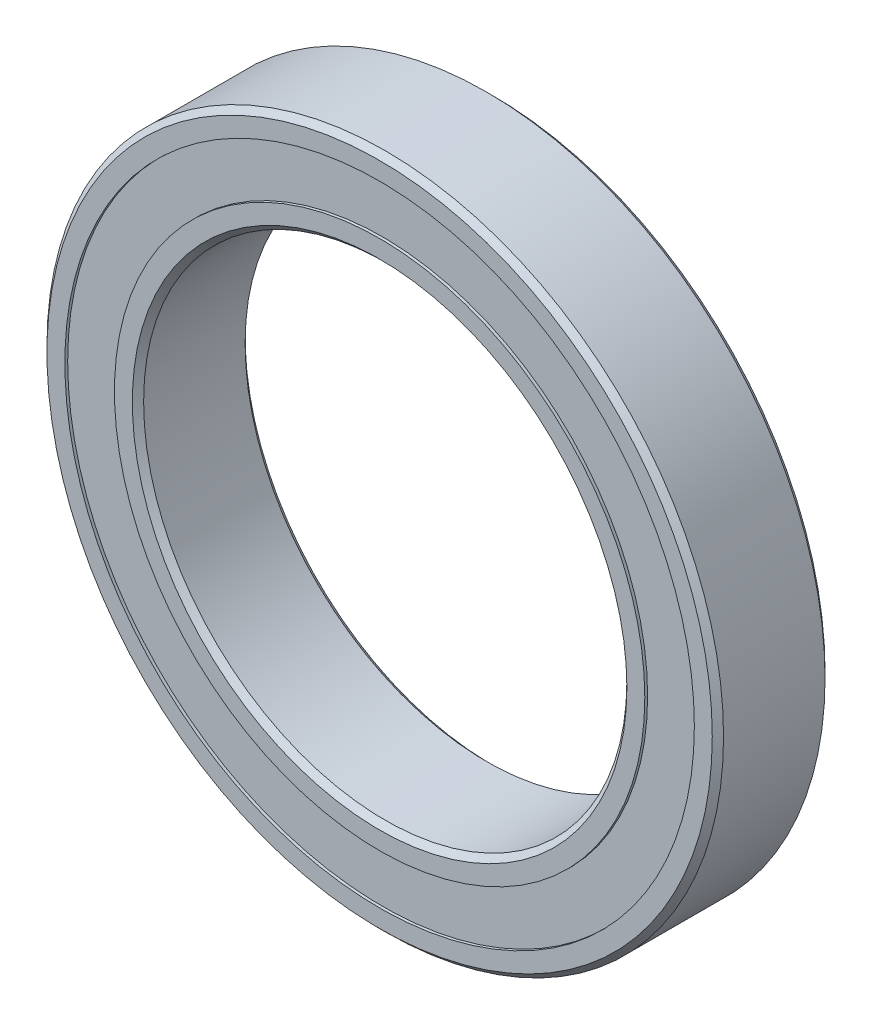
ISO-10303-21;
HEADER;
FILE_DESCRIPTION(('STEP AP214'),'2;1');
FILE_NAME('part.step','',(''),(''),'','','');
FILE_SCHEMA(('AUTOMOTIVE_DESIGN { 1 0 10303 214 1 1 1 1 }'));
ENDSEC;
DATA;
#1=APPLICATION_CONTEXT('core data for automotive mechanical design processes');
#2=APPLICATION_PROTOCOL_DEFINITION('international standard','automotive_design',2000,#1);
#3=PRODUCT_CONTEXT('',#1,'mechanical');
#4=PRODUCT('Part','Part','',(#3));
#5=PRODUCT_RELATED_PRODUCT_CATEGORY('part','',(#4));
#6=PRODUCT_DEFINITION_FORMATION('','',#4);
#7=PRODUCT_DEFINITION_CONTEXT('part definition',#1,'design');
#8=PRODUCT_DEFINITION('design','',#6,#7);
#9=PRODUCT_DEFINITION_SHAPE('','',#8);
#10=(LENGTH_UNIT() NAMED_UNIT(*) SI_UNIT(.MILLI.,.METRE.));
#11=(NAMED_UNIT(*) PLANE_ANGLE_UNIT() SI_UNIT($,.RADIAN.));
#12=(NAMED_UNIT(*) SI_UNIT($,.STERADIAN.) SOLID_ANGLE_UNIT());
#13=UNCERTAINTY_MEASURE_WITH_UNIT(LENGTH_MEASURE(1.E-05),#10,'distance_accuracy_value','');
#14=(GEOMETRIC_REPRESENTATION_CONTEXT(3) GLOBAL_UNCERTAINTY_ASSIGNED_CONTEXT((#13)) GLOBAL_UNIT_ASSIGNED_CONTEXT((#10,
#11,#12)) REPRESENTATION_CONTEXT('',''));
#15=CARTESIAN_POINT('',(0.,0.,0.));
#16=DIRECTION('',(0.,0.,1.));
#17=DIRECTION('',(1.,0.,0.));
#18=AXIS2_PLACEMENT_3D('',#15,#16,#17);
#19=CARTESIAN_POINT('',(-8.99987499999981,15.5882407617691,0.));
#20=DIRECTION('',(0.,0.,1.));
#21=DIRECTION('',(-0.499999999999989,0.866025403784445,0.));
#22=AXIS2_PLACEMENT_3D('',#19,#20,#21);
#23=SPHERICAL_SURFACE('',#22,2.18783385835058);
#24=CARTESIAN_POINT('',(-8.99987499999981,15.5882407617691,2.18783385835058));
#25=VERTEX_POINT('',#24);
#26=VERTEX_LOOP('',#25);
#27=FACE_BOUND('',#26,.T.);
#28=ADVANCED_FACE('F37',(#27),#23,.T.);
#29=CLOSED_SHELL('',(#28));
#30=MANIFOLD_SOLID_BREP('B2',#29);
#31=CARTESIAN_POINT('',(-15.5882407617689,8.99987500000019,0.));
#32=DIRECTION('',(0.,0.,1.));
#33=DIRECTION('',(-0.866025403784433,0.50000000000001,0.));
#34=AXIS2_PLACEMENT_3D('',#31,#32,#33);
#35=SPHERICAL_SURFACE('',#34,2.18783385835058);
#36=CARTESIAN_POINT('',(-15.5882407617689,8.99987500000019,2.18783385835058));
#37=VERTEX_POINT('',#36);
#38=VERTEX_LOOP('',#37);
#39=FACE_BOUND('',#38,.T.);
#40=ADVANCED_FACE('F57',(#39),#35,.T.);
#41=CLOSED_SHELL('',(#40));
#42=MANIFOLD_SOLID_BREP('B6',#41);
#43=CARTESIAN_POINT('',(-17.99975,1.88537373686525E-13,0.));
#44=DIRECTION('',(0.,0.,1.));
#45=DIRECTION('',(-1.,0.,0.));
#46=AXIS2_PLACEMENT_3D('',#43,#44,#45);
#47=SPHERICAL_SURFACE('',#46,2.18783385835058);
#48=CARTESIAN_POINT('',(-17.99975,1.88537373686525E-13,2.18783385835058));
#49=VERTEX_POINT('',#48);
#50=VERTEX_LOOP('',#49);
#51=FACE_BOUND('',#50,.T.);
#52=ADVANCED_FACE('F77',(#51),#47,.T.);
#53=CLOSED_SHELL('',(#52));
#54=MANIFOLD_SOLID_BREP('B33',#53);
#55=CARTESIAN_POINT('',(-15.588240761769,-8.99987499999986,0.));
#56=DIRECTION('',(0.,0.,1.));
#57=DIRECTION('',(-0.866025403784443,-0.499999999999992,0.));
#58=AXIS2_PLACEMENT_3D('',#55,#56,#57);
#59=SPHERICAL_SURFACE('',#58,2.18783385835058);
#60=CARTESIAN_POINT('',(-15.588240761769,-8.99987499999986,2.18783385835058));
#61=VERTEX_POINT('',#60);
#62=VERTEX_LOOP('',#61);
#63=FACE_BOUND('',#62,.T.);
#64=ADVANCED_FACE('F97',(#63),#59,.T.);
#65=CLOSED_SHELL('',(#64));
#66=MANIFOLD_SOLID_BREP('B53',#65);
#67=CARTESIAN_POINT('',(-8.99987500000013,-15.5882407617689,0.));
#68=DIRECTION('',(0.,0.,1.));
#69=DIRECTION('',(-0.500000000000007,-0.866025403784435,0.));
#70=AXIS2_PLACEMENT_3D('',#67,#68,#69);
#71=SPHERICAL_SURFACE('',#70,2.18783385835058);
#72=CARTESIAN_POINT('',(-8.99987500000013,-15.5882407617689,2.18783385835058));
#73=VERTEX_POINT('',#72);
#74=VERTEX_LOOP('',#73);
#75=FACE_BOUND('',#74,.T.);
#76=ADVANCED_FACE('F117',(#75),#71,.T.);
#77=CLOSED_SHELL('',(#76));
#78=MANIFOLD_SOLID_BREP('B73',#77);
#79=CARTESIAN_POINT('',(-1.25691582457683E-13,-17.99975,0.));
#80=DIRECTION('',(0.,0.,1.));
#81=DIRECTION('',(0.,-1.,0.));
#82=AXIS2_PLACEMENT_3D('',#79,#80,#81);
#83=SPHERICAL_SURFACE('',#82,2.18783385835058);
#84=CARTESIAN_POINT('',(-1.25691582457683E-13,-17.99975,2.18783385835058));
#85=VERTEX_POINT('',#84);
#86=VERTEX_LOOP('',#85);
#87=FACE_BOUND('',#86,.T.);
#88=ADVANCED_FACE('F137',(#87),#83,.T.);
#89=CLOSED_SHELL('',(#88));
#90=MANIFOLD_SOLID_BREP('B93',#89);
#91=CARTESIAN_POINT('',(8.99987499999991,-15.588240761769,0.));
#92=DIRECTION('',(0.,0.,1.));
#93=DIRECTION('',(0.499999999999995,-0.866025403784442,0.));
#94=AXIS2_PLACEMENT_3D('',#91,#92,#93);
#95=SPHERICAL_SURFACE('',#94,2.18783385835058);
#96=CARTESIAN_POINT('',(8.99987499999991,-15.588240761769,2.18783385835058));
#97=VERTEX_POINT('',#96);
#98=VERTEX_LOOP('',#97);
#99=FACE_BOUND('',#98,.T.);
#100=ADVANCED_FACE('F157',(#99),#95,.T.);
#101=CLOSED_SHELL('',(#100));
#102=MANIFOLD_SOLID_BREP('B113',#101);
#103=CARTESIAN_POINT('',(15.5882407617689,-8.99987500000008,0.));
#104=DIRECTION('',(0.,0.,1.));
#105=DIRECTION('',(0.866025403784436,-0.500000000000004,0.));
#106=AXIS2_PLACEMENT_3D('',#103,#104,#105);
#107=SPHERICAL_SURFACE('',#106,2.18783385835058);
#108=CARTESIAN_POINT('',(15.5882407617689,-8.99987500000008,2.18783385835058));
#109=VERTEX_POINT('',#108);
#110=VERTEX_LOOP('',#109);
#111=FACE_BOUND('',#110,.T.);
#112=ADVANCED_FACE('F177',(#111),#107,.T.);
#113=CLOSED_SHELL('',(#112));
#114=MANIFOLD_SOLID_BREP('B133',#113);
#115=CARTESIAN_POINT('',(17.99975,0.,0.));
#116=DIRECTION('',(0.,0.,1.));
#117=DIRECTION('',(1.,0.,0.));
#118=AXIS2_PLACEMENT_3D('',#115,#116,#117);
#119=SPHERICAL_SURFACE('',#118,2.18783385835058);
#120=CARTESIAN_POINT('',(17.99975,0.,2.18783385835058));
#121=VERTEX_POINT('',#120);
#122=VERTEX_LOOP('',#121);
#123=FACE_BOUND('',#122,.T.);
#124=ADVANCED_FACE('F197',(#123),#119,.T.);
#125=CLOSED_SHELL('',(#124));
#126=MANIFOLD_SOLID_BREP('B153',#125);
#127=CARTESIAN_POINT('',(15.588240761769,8.99987499999997,0.));
#128=DIRECTION('',(0.,0.,1.));
#129=DIRECTION('',(0.86602540378444,0.499999999999998,0.));
#130=AXIS2_PLACEMENT_3D('',#127,#128,#129);
#131=SPHERICAL_SURFACE('',#130,2.18783385835058);
#132=CARTESIAN_POINT('',(15.588240761769,8.99987499999997,2.18783385835058));
#133=VERTEX_POINT('',#132);
#134=VERTEX_LOOP('',#133);
#135=FACE_BOUND('',#134,.T.);
#136=ADVANCED_FACE('F217',(#135),#131,.T.);
#137=CLOSED_SHELL('',(#136));
#138=MANIFOLD_SOLID_BREP('B173',#137);
#139=CARTESIAN_POINT('',(8.99987500000002,15.5882407617689,0.));
#140=DIRECTION('',(0.,0.,1.));
#141=DIRECTION('',(0.500000000000001,0.866025403784438,0.));
#142=AXIS2_PLACEMENT_3D('',#139,#140,#141);
#143=SPHERICAL_SURFACE('',#142,2.18783385835058);
#144=CARTESIAN_POINT('',(8.99987500000002,15.5882407617689,2.18783385835058));
#145=VERTEX_POINT('',#144);
#146=VERTEX_LOOP('',#145);
#147=FACE_BOUND('',#146,.T.);
#148=ADVANCED_FACE('F237',(#147),#143,.T.);
#149=CLOSED_SHELL('',(#148));
#150=MANIFOLD_SOLID_BREP('B193',#149);
#151=CARTESIAN_POINT('',(0.,17.99975,0.));
#152=DIRECTION('',(0.,0.,1.));
#153=DIRECTION('',(0.,1.,0.));
#154=AXIS2_PLACEMENT_3D('',#151,#152,#153);
#155=SPHERICAL_SURFACE('',#154,2.18783385835058);
#156=CARTESIAN_POINT('',(0.,17.99975,2.18783385835058));
#157=VERTEX_POINT('',#156);
#158=VERTEX_LOOP('',#157);
#159=FACE_BOUND('',#158,.T.);
#160=ADVANCED_FACE('F258',(#159),#155,.T.);
#161=CLOSED_SHELL('',(#160));
#162=MANIFOLD_SOLID_BREP('B213',#161);
#163=CARTESIAN_POINT('',(0.,0.,3.5));
#164=DIRECTION('',(0.,0.,1.));
#165=DIRECTION('',(1.,0.,0.));
#166=AXIS2_PLACEMENT_3D('',#163,#164,#165);
#167=CYLINDRICAL_SURFACE('',#166,19.5382115384615);
#168=CARTESIAN_POINT('',(0.,0.,-3.5));
#169=DIRECTION('',(0.,0.,1.));
#170=DIRECTION('',(1.,0.,0.));
#171=AXIS2_PLACEMENT_3D('',#168,#169,#170);
#172=CIRCLE('',#171,19.5382115384616);
#173=CARTESIAN_POINT('',(19.5382115384616,0.,-3.5));
#174=VERTEX_POINT('',#173);
#175=EDGE_CURVE('E310',#174,#174,#172,.T.);
#176=ORIENTED_EDGE('',*,*,#175,.F.);
#177=EDGE_LOOP('',(#176));
#178=FACE_BOUND('',#177,.T.);
#179=CARTESIAN_POINT('',(0.,0.,-3.32499999999999));
#180=DIRECTION('',(0.,0.,1.));
#181=DIRECTION('',(1.,0.,0.));
#182=AXIS2_PLACEMENT_3D('',#179,#180,#181);
#183=CIRCLE('',#182,19.5382115384615);
#184=CARTESIAN_POINT('',(19.5382115384615,0.,-3.32499999999999));
#185=VERTEX_POINT('',#184);
#186=EDGE_CURVE('E257',#185,#185,#183,.F.);
#187=ORIENTED_EDGE('',*,*,#186,.F.);
#188=EDGE_LOOP('',(#187));
#189=FACE_BOUND('',#188,.T.);
#190=ADVANCED_FACE('F271',(#178,#189),#167,.F.);
#191=CARTESIAN_POINT('',(0.,0.,3.5));
#192=DIRECTION('',(0.,0.,1.));
#193=DIRECTION('',(1.,0.,0.));
#194=AXIS2_PLACEMENT_3D('',#191,#192,#193);
#195=CYLINDRICAL_SURFACE('',#194,16.4612884615385);
#196=CARTESIAN_POINT('',(0.,0.,-3.5));
#197=DIRECTION('',(0.,0.,1.));
#198=DIRECTION('',(1.,0.,0.));
#199=AXIS2_PLACEMENT_3D('',#196,#197,#198);
#200=CIRCLE('',#199,16.4612884615385);
#201=CARTESIAN_POINT('',(16.4612884615385,0.,-3.5));
#202=VERTEX_POINT('',#201);
#203=EDGE_CURVE('E337',#202,#202,#200,.T.);
#204=ORIENTED_EDGE('',*,*,#203,.T.);
#205=EDGE_LOOP('',(#204));
#206=FACE_BOUND('',#205,.T.);
#207=CARTESIAN_POINT('',(0.,0.,-3.32499999999999));
#208=DIRECTION('',(0.,0.,1.));
#209=DIRECTION('',(1.,0.,0.));
#210=AXIS2_PLACEMENT_3D('',#207,#208,#209);
#211=CIRCLE('',#210,16.4612884615385);
#212=CARTESIAN_POINT('',(16.4612884615385,0.,-3.32499999999999));
#213=VERTEX_POINT('',#212);
#214=EDGE_CURVE('E283',#213,#213,#211,.T.);
#215=ORIENTED_EDGE('',*,*,#214,.F.);
#216=EDGE_LOOP('',(#215));
#217=FACE_BOUND('',#216,.T.);
#218=ADVANCED_FACE('F379',(#206,#217),#195,.T.);
#219=CARTESIAN_POINT('',(0.,0.,3.5));
#220=DIRECTION('',(0.,0.,1.));
#221=DIRECTION('',(1.,0.,0.));
#222=AXIS2_PLACEMENT_3D('',#219,#220,#221);
#223=CYLINDRICAL_SURFACE('',#222,19.5382115384615);
#224=CARTESIAN_POINT('',(0.,0.,3.5));
#225=DIRECTION('',(0.,0.,1.));
#226=DIRECTION('',(1.,0.,0.));
#227=AXIS2_PLACEMENT_3D('',#224,#225,#226);
#228=CIRCLE('',#227,19.5382115384616);
#229=CARTESIAN_POINT('',(19.5382115384616,0.,3.5));
#230=VERTEX_POINT('',#229);
#231=EDGE_CURVE('E301',#230,#230,#228,.T.);
#232=ORIENTED_EDGE('',*,*,#231,.T.);
#233=EDGE_LOOP('',(#232));
#234=FACE_BOUND('',#233,.T.);
#235=CARTESIAN_POINT('',(0.,0.,3.32499999999999));
#236=DIRECTION('',(0.,0.,-1.));
#237=DIRECTION('',(-1.,0.,0.));
#238=AXIS2_PLACEMENT_3D('',#235,#236,#237);
#239=CIRCLE('',#238,19.5382115384615);
#240=CARTESIAN_POINT('',(-19.5382115384615,0.,3.32499999999999));
#241=VERTEX_POINT('',#240);
#242=EDGE_CURVE('E292',#241,#241,#239,.F.);
#243=ORIENTED_EDGE('',*,*,#242,.F.);
#244=EDGE_LOOP('',(#243));
#245=FACE_BOUND('',#244,.T.);
#246=ADVANCED_FACE('F377',(#234,#245),#223,.F.);
#247=CARTESIAN_POINT('',(0.,0.,3.15));
#248=DIRECTION('',(0.,0.,-1.));
#249=DIRECTION('',(-1.,0.,0.));
#250=AXIS2_PLACEMENT_3D('',#247,#248,#249);
#251=CONICAL_SURFACE('',#250,21.,0.78539816339744);
#252=CARTESIAN_POINT('',(0.,0.,3.5));
#253=DIRECTION('',(0.,0.,1.));
#254=DIRECTION('',(1.,0.,0.));
#255=AXIS2_PLACEMENT_3D('',#252,#253,#254);
#256=CIRCLE('',#255,20.65);
#257=CARTESIAN_POINT('',(20.65,0.,3.5));
#258=VERTEX_POINT('',#257);
#259=EDGE_CURVE('E298',#258,#258,#256,.T.);
#260=ORIENTED_EDGE('',*,*,#259,.F.);
#261=EDGE_LOOP('',(#260));
#262=FACE_BOUND('',#261,.T.);
#263=CARTESIAN_POINT('',(0.,0.,3.15));
#264=DIRECTION('',(0.,0.,1.));
#265=DIRECTION('',(1.,0.,0.));
#266=AXIS2_PLACEMENT_3D('',#263,#264,#265);
#267=CIRCLE('',#266,21.);
#268=CARTESIAN_POINT('',(21.,0.,3.15));
#269=VERTEX_POINT('',#268);
#270=EDGE_CURVE('E319',#269,#269,#267,.T.);
#271=ORIENTED_EDGE('',*,*,#270,.T.);
#272=EDGE_LOOP('',(#271));
#273=FACE_BOUND('',#272,.T.);
#274=ADVANCED_FACE('F273',(#262,#273),#251,.T.);
#275=CARTESIAN_POINT('',(0.,20.65,3.5));
#276=DIRECTION('',(0.,0.,-1.));
#277=DIRECTION('',(-1.,0.,0.));
#278=AXIS2_PLACEMENT_3D('',#275,#276,#277);
#279=PLANE('',#278);
#280=ORIENTED_EDGE('',*,*,#231,.F.);
#281=EDGE_LOOP('',(#280));
#282=FACE_BOUND('',#281,.T.);
#283=ORIENTED_EDGE('',*,*,#259,.T.);
#284=EDGE_LOOP('',(#283));
#285=FACE_BOUND('',#284,.T.);
#286=ADVANCED_FACE('F387',(#282,#285),#279,.F.);
#287=CARTESIAN_POINT('',(0.,20.65,-3.5));
#288=DIRECTION('',(0.,0.,1.));
#289=DIRECTION('',(1.,0.,0.));
#290=AXIS2_PLACEMENT_3D('',#287,#288,#289);
#291=PLANE('',#290);
#292=CARTESIAN_POINT('',(0.,0.,-3.5));
#293=DIRECTION('',(0.,0.,1.));
#294=DIRECTION('',(1.,0.,0.));
#295=AXIS2_PLACEMENT_3D('',#292,#293,#294);
#296=CIRCLE('',#295,20.65);
#297=CARTESIAN_POINT('',(20.65,0.,-3.5));
#298=VERTEX_POINT('',#297);
#299=EDGE_CURVE('E313',#298,#298,#296,.T.);
#300=ORIENTED_EDGE('',*,*,#299,.F.);
#301=EDGE_LOOP('',(#300));
#302=FACE_BOUND('',#301,.T.);
#303=ORIENTED_EDGE('',*,*,#175,.T.);
#304=EDGE_LOOP('',(#303));
#305=FACE_BOUND('',#304,.T.);
#306=ADVANCED_FACE('F449',(#302,#305),#291,.F.);
#307=CARTESIAN_POINT('',(0.,0.,-3.5));
#308=DIRECTION('',(0.,0.,1.));
#309=DIRECTION('',(1.,0.,0.));
#310=AXIS2_PLACEMENT_3D('',#307,#308,#309);
#311=CONICAL_SURFACE('',#310,20.65,0.78539816339745);
#312=CARTESIAN_POINT('',(0.,0.,-3.15));
#313=DIRECTION('',(0.,0.,1.));
#314=DIRECTION('',(1.,0.,0.));
#315=AXIS2_PLACEMENT_3D('',#312,#313,#314);
#316=CIRCLE('',#315,21.);
#317=CARTESIAN_POINT('',(21.,0.,-3.15));
#318=VERTEX_POINT('',#317);
#319=EDGE_CURVE('E316',#318,#318,#316,.T.);
#320=ORIENTED_EDGE('',*,*,#319,.F.);
#321=EDGE_LOOP('',(#320));
#322=FACE_BOUND('',#321,.T.);
#323=ORIENTED_EDGE('',*,*,#299,.T.);
#324=EDGE_LOOP('',(#323));
#325=FACE_BOUND('',#324,.T.);
#326=ADVANCED_FACE('F446',(#322,#325),#311,.T.);
#327=CARTESIAN_POINT('',(0.,0.,3.5));
#328=DIRECTION('',(0.,0.,1.));
#329=DIRECTION('',(1.,0.,0.));
#330=AXIS2_PLACEMENT_3D('',#327,#328,#329);
#331=CYLINDRICAL_SURFACE('',#330,21.);
#332=ORIENTED_EDGE('',*,*,#270,.F.);
#333=EDGE_LOOP('',(#332));
#334=FACE_BOUND('',#333,.T.);
#335=ORIENTED_EDGE('',*,*,#319,.T.);
#336=EDGE_LOOP('',(#335));
#337=FACE_BOUND('',#336,.T.);
#338=ADVANCED_FACE('F373',(#334,#337),#331,.T.);
#339=CARTESIAN_POINT('',(0.,19.5382115384616,3.32499999999999));
#340=DIRECTION('',(0.,0.,-1.));
#341=DIRECTION('',(-1.,0.,0.));
#342=AXIS2_PLACEMENT_3D('',#339,#340,#341);
#343=PLANE('',#342);
#344=CARTESIAN_POINT('',(0.,0.,3.32499999999999));
#345=DIRECTION('',(0.,0.,1.));
#346=DIRECTION('',(1.,0.,0.));
#347=AXIS2_PLACEMENT_3D('',#344,#345,#346);
#348=CIRCLE('',#347,16.4612884615385);
#349=CARTESIAN_POINT('',(16.4612884615385,0.,3.32499999999999));
#350=VERTEX_POINT('',#349);
#351=EDGE_CURVE('E322',#350,#350,#348,.T.);
#352=ORIENTED_EDGE('',*,*,#351,.F.);
#353=EDGE_LOOP('',(#352));
#354=FACE_BOUND('',#353,.T.);
#355=ORIENTED_EDGE('',*,*,#242,.T.);
#356=EDGE_LOOP('',(#355));
#357=FACE_BOUND('',#356,.T.);
#358=ADVANCED_FACE('F366',(#354,#357),#343,.F.);
#359=CARTESIAN_POINT('',(0.,0.,3.5));
#360=DIRECTION('',(0.,0.,1.));
#361=DIRECTION('',(1.,0.,0.));
#362=AXIS2_PLACEMENT_3D('',#359,#360,#361);
#363=CYLINDRICAL_SURFACE('',#362,16.4612884615385);
#364=CARTESIAN_POINT('',(0.,0.,3.5));
#365=DIRECTION('',(0.,0.,1.));
#366=DIRECTION('',(1.,0.,0.));
#367=AXIS2_PLACEMENT_3D('',#364,#365,#366);
#368=CIRCLE('',#367,16.4612884615385);
#369=CARTESIAN_POINT('',(16.4612884615385,0.,3.5));
#370=VERTEX_POINT('',#369);
#371=EDGE_CURVE('E346',#370,#370,#368,.T.);
#372=ORIENTED_EDGE('',*,*,#371,.F.);
#373=EDGE_LOOP('',(#372));
#374=FACE_BOUND('',#373,.T.);
#375=ORIENTED_EDGE('',*,*,#351,.T.);
#376=EDGE_LOOP('',(#375));
#377=FACE_BOUND('',#376,.T.);
#378=ADVANCED_FACE('F363',(#374,#377),#363,.T.);
#379=CARTESIAN_POINT('',(0.,0.,3.5));
#380=DIRECTION('',(0.,0.,1.));
#381=DIRECTION('',(1.,0.,0.));
#382=AXIS2_PLACEMENT_3D('',#379,#380,#381);
#383=CONICAL_SURFACE('',#382,15.3495,0.785398163397457);
#384=CARTESIAN_POINT('',(0.,0.,3.15));
#385=DIRECTION('',(0.,0.,1.));
#386=DIRECTION('',(1.,0.,0.));
#387=AXIS2_PLACEMENT_3D('',#384,#385,#386);
#388=CIRCLE('',#387,14.9995);
#389=CARTESIAN_POINT('',(14.9995,0.,3.15));
#390=VERTEX_POINT('',#389);
#391=EDGE_CURVE('E328',#390,#390,#388,.T.);
#392=ORIENTED_EDGE('',*,*,#391,.F.);
#393=EDGE_LOOP('',(#392));
#394=FACE_BOUND('',#393,.T.);
#395=CARTESIAN_POINT('',(0.,0.,3.5));
#396=DIRECTION('',(0.,0.,1.));
#397=DIRECTION('',(1.,0.,0.));
#398=AXIS2_PLACEMENT_3D('',#395,#396,#397);
#399=CIRCLE('',#398,15.3495);
#400=CARTESIAN_POINT('',(15.3495,0.,3.5));
#401=VERTEX_POINT('',#400);
#402=EDGE_CURVE('E349',#401,#401,#399,.T.);
#403=ORIENTED_EDGE('',*,*,#402,.T.);
#404=EDGE_LOOP('',(#403));
#405=FACE_BOUND('',#404,.T.);
#406=ADVANCED_FACE('F353',(#394,#405),#383,.F.);
#407=CARTESIAN_POINT('',(0.,0.,3.5));
#408=DIRECTION('',(0.,0.,1.));
#409=DIRECTION('',(1.,0.,0.));
#410=AXIS2_PLACEMENT_3D('',#407,#408,#409);
#411=CYLINDRICAL_SURFACE('',#410,14.9995);
#412=CARTESIAN_POINT('',(0.,0.,-3.15));
#413=DIRECTION('',(0.,0.,1.));
#414=DIRECTION('',(1.,0.,0.));
#415=AXIS2_PLACEMENT_3D('',#412,#413,#414);
#416=CIRCLE('',#415,14.9995);
#417=CARTESIAN_POINT('',(14.9995,0.,-3.15));
#418=VERTEX_POINT('',#417);
#419=EDGE_CURVE('E331',#418,#418,#416,.T.);
#420=ORIENTED_EDGE('',*,*,#419,.F.);
#421=EDGE_LOOP('',(#420));
#422=FACE_BOUND('',#421,.T.);
#423=ORIENTED_EDGE('',*,*,#391,.T.);
#424=EDGE_LOOP('',(#423));
#425=FACE_BOUND('',#424,.T.);
#426=ADVANCED_FACE('F436',(#422,#425),#411,.F.);
#427=CARTESIAN_POINT('',(0.,0.,-3.15));
#428=DIRECTION('',(0.,0.,-1.));
#429=DIRECTION('',(-1.,0.,0.));
#430=AXIS2_PLACEMENT_3D('',#427,#428,#429);
#431=CONICAL_SURFACE('',#430,14.9995,0.785398163397452);
#432=CARTESIAN_POINT('',(0.,0.,-3.5));
#433=DIRECTION('',(0.,0.,1.));
#434=DIRECTION('',(1.,0.,0.));
#435=AXIS2_PLACEMENT_3D('',#432,#433,#434);
#436=CIRCLE('',#435,15.3495);
#437=CARTESIAN_POINT('',(15.3495,0.,-3.5));
#438=VERTEX_POINT('',#437);
#439=EDGE_CURVE('E334',#438,#438,#436,.T.);
#440=ORIENTED_EDGE('',*,*,#439,.F.);
#441=EDGE_LOOP('',(#440));
#442=FACE_BOUND('',#441,.T.);
#443=ORIENTED_EDGE('',*,*,#419,.T.);
#444=EDGE_LOOP('',(#443));
#445=FACE_BOUND('',#444,.T.);
#446=ADVANCED_FACE('F432',(#442,#445),#431,.F.);
#447=CARTESIAN_POINT('',(0.,15.3495,-3.5));
#448=DIRECTION('',(0.,0.,1.));
#449=DIRECTION('',(1.,0.,0.));
#450=AXIS2_PLACEMENT_3D('',#447,#448,#449);
#451=PLANE('',#450);
#452=ORIENTED_EDGE('',*,*,#203,.F.);
#453=EDGE_LOOP('',(#452));
#454=FACE_BOUND('',#453,.T.);
#455=ORIENTED_EDGE('',*,*,#439,.T.);
#456=EDGE_LOOP('',(#455));
#457=FACE_BOUND('',#456,.T.);
#458=ADVANCED_FACE('F359',(#454,#457),#451,.F.);
#459=CARTESIAN_POINT('',(0.,15.3495,3.5));
#460=DIRECTION('',(0.,0.,-1.));
#461=DIRECTION('',(-1.,0.,0.));
#462=AXIS2_PLACEMENT_3D('',#459,#460,#461);
#463=PLANE('',#462);
#464=ORIENTED_EDGE('',*,*,#402,.F.);
#465=EDGE_LOOP('',(#464));
#466=FACE_BOUND('',#465,.T.);
#467=ORIENTED_EDGE('',*,*,#371,.T.);
#468=EDGE_LOOP('',(#467));
#469=FACE_BOUND('',#468,.T.);
#470=ADVANCED_FACE('F355',(#466,#469),#463,.F.);
#471=CARTESIAN_POINT('',(0.,19.5382115384616,-3.32499999999999));
#472=DIRECTION('',(0.,0.,1.));
#473=DIRECTION('',(1.,0.,0.));
#474=AXIS2_PLACEMENT_3D('',#471,#472,#473);
#475=PLANE('',#474);
#476=ORIENTED_EDGE('',*,*,#186,.T.);
#477=EDGE_LOOP('',(#476));
#478=FACE_BOUND('',#477,.T.);
#479=ORIENTED_EDGE('',*,*,#214,.T.);
#480=EDGE_LOOP('',(#479));
#481=FACE_BOUND('',#480,.T.);
#482=ADVANCED_FACE('F358',(#478,#481),#475,.F.);
#483=CLOSED_SHELL('',(#190,#218,#246,#274,#286,#306,#326,#338,#358,#378,#406,#426,#446,#458,
#470,#482));
#484=CARTESIAN_POINT('',(0.,19.5382115384616,-2.18783385835058));
#485=DIRECTION('',(0.,0.,-1.));
#486=DIRECTION('',(-1.,0.,0.));
#487=AXIS2_PLACEMENT_3D('',#484,#485,#486);
#488=PLANE('',#487);
#489=CARTESIAN_POINT('',(0.,0.,-2.18783385835058));
#490=DIRECTION('',(0.,0.,-1.));
#491=DIRECTION('',(-1.,0.,0.));
#492=AXIS2_PLACEMENT_3D('',#489,#490,#491);
#493=CIRCLE('',#492,16.4612884615385);
#494=CARTESIAN_POINT('',(-16.4612884615385,0.,-2.18783385835058));
#495=VERTEX_POINT('',#494);
#496=EDGE_CURVE('E287',#495,#495,#493,.T.);
#497=ORIENTED_EDGE('',*,*,#496,.T.);
#498=EDGE_LOOP('',(#497));
#499=FACE_BOUND('',#498,.T.);
#500=CARTESIAN_POINT('',(0.,0.,-2.18783385835058));
#501=DIRECTION('',(0.,0.,-1.));
#502=DIRECTION('',(-1.,0.,0.));
#503=AXIS2_PLACEMENT_3D('',#500,#501,#502);
#504=CIRCLE('',#503,19.5382115384615);
#505=CARTESIAN_POINT('',(-19.5382115384615,0.,-2.18783385835058));
#506=VERTEX_POINT('',#505);
#507=EDGE_CURVE('E279',#506,#506,#504,.F.);
#508=ORIENTED_EDGE('',*,*,#507,.T.);
#509=EDGE_LOOP('',(#508));
#510=FACE_BOUND('',#509,.T.);
#511=ADVANCED_FACE('F395',(#499,#510),#488,.F.);
#512=CARTESIAN_POINT('',(0.,0.,1.55555555555556));
#513=DIRECTION('',(0.,0.,1.));
#514=DIRECTION('',(1.,0.,0.));
#515=AXIS2_PLACEMENT_3D('',#512,#513,#514);
#516=CIRCLE('',#515,19.5382115384615);
#517=CARTESIAN_POINT('',(19.5382115384615,0.,1.55555555555556));
#518=VERTEX_POINT('',#517);
#519=EDGE_CURVE('E304',#518,#518,#516,.T.);
#520=ORIENTED_EDGE('',*,*,#519,.F.);
#521=EDGE_LOOP('',(#520));
#522=FACE_BOUND('',#521,.T.);
#523=CARTESIAN_POINT('',(0.,0.,2.18783385835058));
#524=DIRECTION('',(0.,0.,1.));
#525=DIRECTION('',(1.,0.,0.));
#526=AXIS2_PLACEMENT_3D('',#523,#524,#525);
#527=CIRCLE('',#526,19.5382115384615);
#528=CARTESIAN_POINT('',(19.5382115384615,0.,2.18783385835058));
#529=VERTEX_POINT('',#528);
#530=EDGE_CURVE('E295',#529,#529,#527,.F.);
#531=ORIENTED_EDGE('',*,*,#530,.F.);
#532=EDGE_LOOP('',(#531));
#533=FACE_BOUND('',#532,.T.);
#534=ADVANCED_FACE('F382',(#522,#533),#223,.F.);
#535=CARTESIAN_POINT('',(0.,0.,0.));
#536=DIRECTION('',(0.,0.,1.));
#537=DIRECTION('',(1.,0.,0.));
#538=AXIS2_PLACEMENT_3D('',#535,#536,#537);
#539=TOROIDAL_SURFACE('',#538,17.99975,2.18783385835058);
#540=CARTESIAN_POINT('',(0.,0.,-1.55555555555556));
#541=DIRECTION('',(0.,0.,1.));
#542=DIRECTION('',(1.,0.,0.));
#543=AXIS2_PLACEMENT_3D('',#540,#541,#542);
#544=CIRCLE('',#543,19.5382115384615);
#545=CARTESIAN_POINT('',(19.5382115384615,0.,-1.55555555555556));
#546=VERTEX_POINT('',#545);
#547=EDGE_CURVE('E307',#546,#546,#544,.T.);
#548=ORIENTED_EDGE('',*,*,#547,.F.);
#549=EDGE_LOOP('',(#548));
#550=FACE_BOUND('',#549,.T.);
#551=ORIENTED_EDGE('',*,*,#519,.T.);
#552=EDGE_LOOP('',(#551));
#553=FACE_BOUND('',#552,.T.);
#554=ADVANCED_FACE('F394',(#550,#553),#539,.F.);
#555=ORIENTED_EDGE('',*,*,#547,.T.);
#556=EDGE_LOOP('',(#555));
#557=FACE_BOUND('',#556,.T.);
#558=ORIENTED_EDGE('',*,*,#507,.F.);
#559=EDGE_LOOP('',(#558));
#560=FACE_BOUND('',#559,.T.);
#561=ADVANCED_FACE('F401',(#557,#560),#167,.F.);
#562=CARTESIAN_POINT('',(0.,19.5382115384616,2.18783385835058));
#563=DIRECTION('',(0.,0.,1.));
#564=DIRECTION('',(1.,0.,0.));
#565=AXIS2_PLACEMENT_3D('',#562,#563,#564);
#566=PLANE('',#565);
#567=ORIENTED_EDGE('',*,*,#530,.T.);
#568=EDGE_LOOP('',(#567));
#569=FACE_BOUND('',#568,.T.);
#570=CARTESIAN_POINT('',(0.,0.,2.18783385835058));
#571=DIRECTION('',(0.,0.,1.));
#572=DIRECTION('',(1.,0.,0.));
#573=AXIS2_PLACEMENT_3D('',#570,#571,#572);
#574=CIRCLE('',#573,16.4612884615385);
#575=CARTESIAN_POINT('',(16.4612884615385,0.,2.18783385835058));
#576=VERTEX_POINT('',#575);
#577=EDGE_CURVE('E325',#576,#576,#574,.F.);
#578=ORIENTED_EDGE('',*,*,#577,.F.);
#579=EDGE_LOOP('',(#578));
#580=FACE_BOUND('',#579,.T.);
#581=ADVANCED_FACE('F408',(#569,#580),#566,.F.);
#582=CARTESIAN_POINT('',(0.,0.,1.55555555555556));
#583=DIRECTION('',(0.,0.,1.));
#584=DIRECTION('',(1.,0.,0.));
#585=AXIS2_PLACEMENT_3D('',#582,#583,#584);
#586=CIRCLE('',#585,16.4612884615385);
#587=CARTESIAN_POINT('',(16.4612884615385,0.,1.55555555555556));
#588=VERTEX_POINT('',#587);
#589=EDGE_CURVE('E343',#588,#588,#586,.T.);
#590=ORIENTED_EDGE('',*,*,#589,.T.);
#591=EDGE_LOOP('',(#590));
#592=FACE_BOUND('',#591,.T.);
#593=ORIENTED_EDGE('',*,*,#577,.T.);
#594=EDGE_LOOP('',(#593));
#595=FACE_BOUND('',#594,.T.);
#596=ADVANCED_FACE('F368',(#592,#595),#363,.T.);
#597=CARTESIAN_POINT('',(0.,0.,0.));
#598=DIRECTION('',(0.,0.,1.));
#599=DIRECTION('',(1.,0.,0.));
#600=AXIS2_PLACEMENT_3D('',#597,#598,#599);
#601=TOROIDAL_SURFACE('',#600,17.99975,2.18783385835058);
#602=ORIENTED_EDGE('',*,*,#589,.F.);
#603=EDGE_LOOP('',(#602));
#604=FACE_BOUND('',#603,.T.);
#605=CARTESIAN_POINT('',(0.,0.,-1.55555555555556));
#606=DIRECTION('',(0.,0.,1.));
#607=DIRECTION('',(1.,0.,0.));
#608=AXIS2_PLACEMENT_3D('',#605,#606,#607);
#609=CIRCLE('',#608,16.4612884615385);
#610=CARTESIAN_POINT('',(16.4612884615385,0.,-1.55555555555556));
#611=VERTEX_POINT('',#610);
#612=EDGE_CURVE('E340',#611,#611,#609,.T.);
#613=ORIENTED_EDGE('',*,*,#612,.T.);
#614=EDGE_LOOP('',(#613));
#615=FACE_BOUND('',#614,.T.);
#616=ADVANCED_FACE('F426',(#604,#615),#601,.F.);
#617=ORIENTED_EDGE('',*,*,#612,.F.);
#618=EDGE_LOOP('',(#617));
#619=FACE_BOUND('',#618,.T.);
#620=ORIENTED_EDGE('',*,*,#496,.F.);
#621=EDGE_LOOP('',(#620));
#622=FACE_BOUND('',#621,.T.);
#623=ADVANCED_FACE('F391',(#619,#622),#195,.T.);
#624=CLOSED_SHELL('',(#511,#534,#554,#561,#581,#596,#616,#623));
#625=ORIENTED_CLOSED_SHELL('',*,#624,.T.);
#626=BREP_WITH_VOIDS('B233',#483,(#625));
#627=ADVANCED_BREP_SHAPE_REPRESENTATION('',(#18,#30,#42,#54,#66,#78,#90,#102,#114,#126,#138,
#150,#162,#626),#14);
#628=SHAPE_DEFINITION_REPRESENTATION(#9,#627);
ENDSEC;
END-ISO-10303-21;
